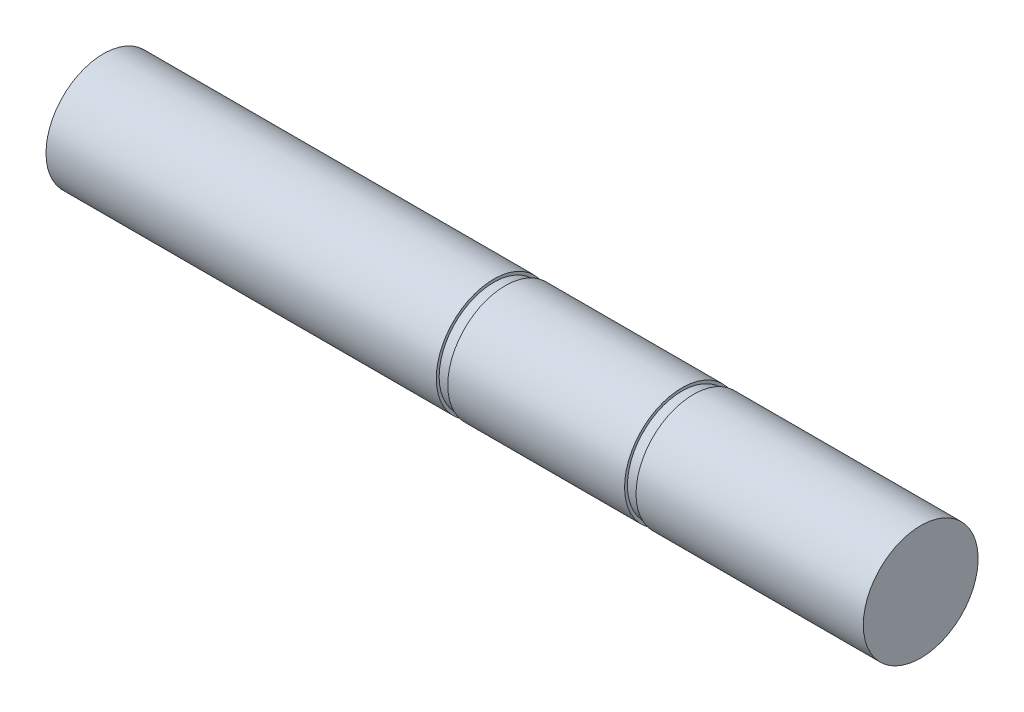
ISO-10303-21;
HEADER;
FILE_DESCRIPTION(('STEP AP214'),'2;1');
FILE_NAME('part.step','',(''),(''),'','','');
FILE_SCHEMA(('AUTOMOTIVE_DESIGN { 1 0 10303 214 1 1 1 1 }'));
ENDSEC;
DATA;
#1=APPLICATION_CONTEXT('core data for automotive mechanical design processes');
#2=APPLICATION_PROTOCOL_DEFINITION('international standard','automotive_design',2000,#1);
#3=PRODUCT_CONTEXT('',#1,'mechanical');
#4=PRODUCT('Part','Part','',(#3));
#5=PRODUCT_RELATED_PRODUCT_CATEGORY('part','',(#4));
#6=PRODUCT_DEFINITION_FORMATION('','',#4);
#7=PRODUCT_DEFINITION_CONTEXT('part definition',#1,'design');
#8=PRODUCT_DEFINITION('design','',#6,#7);
#9=PRODUCT_DEFINITION_SHAPE('','',#8);
#10=(LENGTH_UNIT() NAMED_UNIT(*) SI_UNIT(.MILLI.,.METRE.));
#11=(NAMED_UNIT(*) PLANE_ANGLE_UNIT() SI_UNIT($,.RADIAN.));
#12=(NAMED_UNIT(*) SI_UNIT($,.STERADIAN.) SOLID_ANGLE_UNIT());
#13=UNCERTAINTY_MEASURE_WITH_UNIT(LENGTH_MEASURE(1.E-05),#10,'distance_accuracy_value','');
#14=(GEOMETRIC_REPRESENTATION_CONTEXT(3) GLOBAL_UNCERTAINTY_ASSIGNED_CONTEXT((#13)) GLOBAL_UNIT_ASSIGNED_CONTEXT((#10,
#11,#12)) REPRESENTATION_CONTEXT('',''));
#15=CARTESIAN_POINT('',(0.,0.,0.));
#16=DIRECTION('',(0.,0.,1.));
#17=DIRECTION('',(1.,0.,0.));
#18=AXIS2_PLACEMENT_3D('',#15,#16,#17);
#19=CARTESIAN_POINT('',(-0.499999999999001,0.,0.));
#20=DIRECTION('',(-1.,0.,0.));
#21=DIRECTION('',(0.,0.,1.));
#22=AXIS2_PLACEMENT_3D('',#19,#20,#21);
#23=CYLINDRICAL_SURFACE('',#22,2.5);
#24=CARTESIAN_POINT('',(-0.499999999999001,0.,0.));
#25=DIRECTION('',(-1.,0.,0.));
#26=DIRECTION('',(0.,0.,1.));
#27=AXIS2_PLACEMENT_3D('',#24,#25,#26);
#28=CIRCLE('',#27,2.5);
#29=CARTESIAN_POINT('',(-0.499999999999001,0.,2.5));
#30=VERTEX_POINT('',#29);
#31=EDGE_CURVE('E10',#30,#30,#28,.T.);
#32=ORIENTED_EDGE('',*,*,#31,.F.);
#33=EDGE_LOOP('',(#32));
#34=FACE_BOUND('',#33,.T.);
#35=CARTESIAN_POINT('',(16.5,0.,0.));
#36=DIRECTION('',(-1.,0.,0.));
#37=DIRECTION('',(0.,0.,1.));
#38=AXIS2_PLACEMENT_3D('',#35,#36,#37);
#39=CIRCLE('',#38,2.5);
#40=CARTESIAN_POINT('',(16.5,0.,2.5));
#41=VERTEX_POINT('',#40);
#42=EDGE_CURVE('E69',#41,#41,#39,.T.);
#43=ORIENTED_EDGE('',*,*,#42,.T.);
#44=EDGE_LOOP('',(#43));
#45=FACE_BOUND('',#44,.T.);
#46=ADVANCED_FACE('F35',(#34,#45),#23,.T.);
#47=CARTESIAN_POINT('',(-0.499999999999001,2.5,0.));
#48=DIRECTION('',(1.,0.,0.));
#49=DIRECTION('',(0.,0.,-1.));
#50=AXIS2_PLACEMENT_3D('',#47,#48,#49);
#51=PLANE('',#50);
#52=ORIENTED_EDGE('',*,*,#31,.T.);
#53=EDGE_LOOP('',(#52));
#54=FACE_BOUND('',#53,.T.);
#55=ADVANCED_FACE('F123',(#54),#51,.F.);
#56=CARTESIAN_POINT('',(35.099999999999,0.,0.));
#57=DIRECTION('',(-1.,0.,0.));
#58=DIRECTION('',(0.,0.,1.));
#59=AXIS2_PLACEMENT_3D('',#56,#57,#58);
#60=PLANE('',#59);
#61=CARTESIAN_POINT('',(35.099999999999,0.,0.));
#62=DIRECTION('',(-1.,0.,0.));
#63=DIRECTION('',(0.,0.,1.));
#64=AXIS2_PLACEMENT_3D('',#61,#62,#63);
#65=CIRCLE('',#64,2.5);
#66=CARTESIAN_POINT('',(35.099999999999,0.,2.5));
#67=VERTEX_POINT('',#66);
#68=EDGE_CURVE('E41',#67,#67,#65,.T.);
#69=ORIENTED_EDGE('',*,*,#68,.F.);
#70=EDGE_LOOP('',(#69));
#71=FACE_BOUND('',#70,.T.);
#72=ADVANCED_FACE('F118',(#71),#60,.F.);
#73=CARTESIAN_POINT('',(-0.499999999999001,0.,0.));
#74=DIRECTION('',(-1.,0.,0.));
#75=DIRECTION('',(0.,0.,1.));
#76=AXIS2_PLACEMENT_3D('',#73,#74,#75);
#77=CYLINDRICAL_SURFACE('',#76,2.5);
#78=CARTESIAN_POINT('',(25.2,0.,0.));
#79=DIRECTION('',(-1.,0.,0.));
#80=DIRECTION('',(0.,0.,1.));
#81=AXIS2_PLACEMENT_3D('',#78,#79,#80);
#82=CIRCLE('',#81,2.5);
#83=CARTESIAN_POINT('',(25.2,0.,2.5));
#84=VERTEX_POINT('',#83);
#85=EDGE_CURVE('E45',#84,#84,#82,.T.);
#86=ORIENTED_EDGE('',*,*,#85,.F.);
#87=EDGE_LOOP('',(#86));
#88=FACE_BOUND('',#87,.T.);
#89=ORIENTED_EDGE('',*,*,#68,.T.);
#90=EDGE_LOOP('',(#89));
#91=FACE_BOUND('',#90,.T.);
#92=ADVANCED_FACE('F113',(#88,#91),#77,.T.);
#93=CARTESIAN_POINT('',(25.2,2.5,0.));
#94=DIRECTION('',(1.,0.,0.));
#95=DIRECTION('',(0.,0.,-1.));
#96=AXIS2_PLACEMENT_3D('',#93,#94,#95);
#97=PLANE('',#96);
#98=CARTESIAN_POINT('',(25.2,0.,0.));
#99=DIRECTION('',(-1.,0.,0.));
#100=DIRECTION('',(0.,0.,1.));
#101=AXIS2_PLACEMENT_3D('',#98,#99,#100);
#102=CIRCLE('',#101,2.375);
#103=CARTESIAN_POINT('',(25.2,0.,2.375));
#104=VERTEX_POINT('',#103);
#105=EDGE_CURVE('E49',#104,#104,#102,.T.);
#106=ORIENTED_EDGE('',*,*,#105,.F.);
#107=EDGE_LOOP('',(#106));
#108=FACE_BOUND('',#107,.T.);
#109=ORIENTED_EDGE('',*,*,#85,.T.);
#110=EDGE_LOOP('',(#109));
#111=FACE_BOUND('',#110,.T.);
#112=ADVANCED_FACE('F107',(#108,#111),#97,.F.);
#113=CARTESIAN_POINT('',(-0.499999999999001,0.,0.));
#114=DIRECTION('',(-1.,0.,0.));
#115=DIRECTION('',(0.,0.,1.));
#116=AXIS2_PLACEMENT_3D('',#113,#114,#115);
#117=CYLINDRICAL_SURFACE('',#116,2.375);
#118=CARTESIAN_POINT('',(24.7,0.,0.));
#119=DIRECTION('',(-1.,0.,0.));
#120=DIRECTION('',(0.,0.,1.));
#121=AXIS2_PLACEMENT_3D('',#118,#119,#120);
#122=CIRCLE('',#121,2.375);
#123=CARTESIAN_POINT('',(24.7,0.,2.375));
#124=VERTEX_POINT('',#123);
#125=EDGE_CURVE('E54',#124,#124,#122,.T.);
#126=ORIENTED_EDGE('',*,*,#125,.F.);
#127=EDGE_LOOP('',(#126));
#128=FACE_BOUND('',#127,.T.);
#129=ORIENTED_EDGE('',*,*,#105,.T.);
#130=EDGE_LOOP('',(#129));
#131=FACE_BOUND('',#130,.T.);
#132=ADVANCED_FACE('F101',(#128,#131),#117,.T.);
#133=CARTESIAN_POINT('',(24.7,2.375,0.));
#134=DIRECTION('',(-1.,0.,0.));
#135=DIRECTION('',(0.,0.,1.));
#136=AXIS2_PLACEMENT_3D('',#133,#134,#135);
#137=PLANE('',#136);
#138=CARTESIAN_POINT('',(24.7,0.,0.));
#139=DIRECTION('',(-1.,0.,0.));
#140=DIRECTION('',(0.,0.,1.));
#141=AXIS2_PLACEMENT_3D('',#138,#139,#140);
#142=CIRCLE('',#141,2.5);
#143=CARTESIAN_POINT('',(24.7,0.,2.5));
#144=VERTEX_POINT('',#143);
#145=EDGE_CURVE('E57',#144,#144,#142,.T.);
#146=ORIENTED_EDGE('',*,*,#145,.F.);
#147=EDGE_LOOP('',(#146));
#148=FACE_BOUND('',#147,.T.);
#149=ORIENTED_EDGE('',*,*,#125,.T.);
#150=EDGE_LOOP('',(#149));
#151=FACE_BOUND('',#150,.T.);
#152=ADVANCED_FACE('F95',(#148,#151),#137,.F.);
#153=CARTESIAN_POINT('',(-0.499999999999001,0.,0.));
#154=DIRECTION('',(-1.,0.,0.));
#155=DIRECTION('',(0.,0.,1.));
#156=AXIS2_PLACEMENT_3D('',#153,#154,#155);
#157=CYLINDRICAL_SURFACE('',#156,2.5);
#158=CARTESIAN_POINT('',(17.,0.,0.));
#159=DIRECTION('',(-1.,0.,0.));
#160=DIRECTION('',(0.,0.,1.));
#161=AXIS2_PLACEMENT_3D('',#158,#159,#160);
#162=CIRCLE('',#161,2.5);
#163=CARTESIAN_POINT('',(17.,0.,2.5));
#164=VERTEX_POINT('',#163);
#165=EDGE_CURVE('E60',#164,#164,#162,.T.);
#166=ORIENTED_EDGE('',*,*,#165,.F.);
#167=EDGE_LOOP('',(#166));
#168=FACE_BOUND('',#167,.T.);
#169=ORIENTED_EDGE('',*,*,#145,.T.);
#170=EDGE_LOOP('',(#169));
#171=FACE_BOUND('',#170,.T.);
#172=ADVANCED_FACE('F89',(#168,#171),#157,.T.);
#173=CARTESIAN_POINT('',(17.,2.5,0.));
#174=DIRECTION('',(1.,0.,0.));
#175=DIRECTION('',(0.,0.,-1.));
#176=AXIS2_PLACEMENT_3D('',#173,#174,#175);
#177=PLANE('',#176);
#178=CARTESIAN_POINT('',(17.,0.,0.));
#179=DIRECTION('',(-1.,0.,0.));
#180=DIRECTION('',(0.,0.,1.));
#181=AXIS2_PLACEMENT_3D('',#178,#179,#180);
#182=CIRCLE('',#181,2.375);
#183=CARTESIAN_POINT('',(17.,0.,2.375));
#184=VERTEX_POINT('',#183);
#185=EDGE_CURVE('E63',#184,#184,#182,.T.);
#186=ORIENTED_EDGE('',*,*,#185,.F.);
#187=EDGE_LOOP('',(#186));
#188=FACE_BOUND('',#187,.T.);
#189=ORIENTED_EDGE('',*,*,#165,.T.);
#190=EDGE_LOOP('',(#189));
#191=FACE_BOUND('',#190,.T.);
#192=ADVANCED_FACE('F83',(#188,#191),#177,.F.);
#193=CARTESIAN_POINT('',(-0.499999999999001,0.,0.));
#194=DIRECTION('',(-1.,0.,0.));
#195=DIRECTION('',(0.,0.,1.));
#196=AXIS2_PLACEMENT_3D('',#193,#194,#195);
#197=CYLINDRICAL_SURFACE('',#196,2.375);
#198=CARTESIAN_POINT('',(16.5,0.,0.));
#199=DIRECTION('',(-1.,0.,0.));
#200=DIRECTION('',(0.,0.,1.));
#201=AXIS2_PLACEMENT_3D('',#198,#199,#200);
#202=CIRCLE('',#201,2.375);
#203=CARTESIAN_POINT('',(16.5,0.,2.375));
#204=VERTEX_POINT('',#203);
#205=EDGE_CURVE('E66',#204,#204,#202,.T.);
#206=ORIENTED_EDGE('',*,*,#205,.F.);
#207=EDGE_LOOP('',(#206));
#208=FACE_BOUND('',#207,.T.);
#209=ORIENTED_EDGE('',*,*,#185,.T.);
#210=EDGE_LOOP('',(#209));
#211=FACE_BOUND('',#210,.T.);
#212=ADVANCED_FACE('F77',(#208,#211),#197,.T.);
#213=CARTESIAN_POINT('',(16.5,2.375,0.));
#214=DIRECTION('',(-1.,0.,0.));
#215=DIRECTION('',(0.,0.,1.));
#216=AXIS2_PLACEMENT_3D('',#213,#214,#215);
#217=PLANE('',#216);
#218=ORIENTED_EDGE('',*,*,#42,.F.);
#219=EDGE_LOOP('',(#218));
#220=FACE_BOUND('',#219,.T.);
#221=ORIENTED_EDGE('',*,*,#205,.T.);
#222=EDGE_LOOP('',(#221));
#223=FACE_BOUND('',#222,.T.);
#224=ADVANCED_FACE('F74',(#220,#223),#217,.F.);
#225=CLOSED_SHELL('',(#46,#55,#72,#92,#112,#132,#152,#172,#192,#212,#224));
#226=MANIFOLD_SOLID_BREP('B2',#225);
#227=ADVANCED_BREP_SHAPE_REPRESENTATION('',(#18,#226),#14);
#228=SHAPE_DEFINITION_REPRESENTATION(#9,#227);
ENDSEC;
END-ISO-10303-21;
